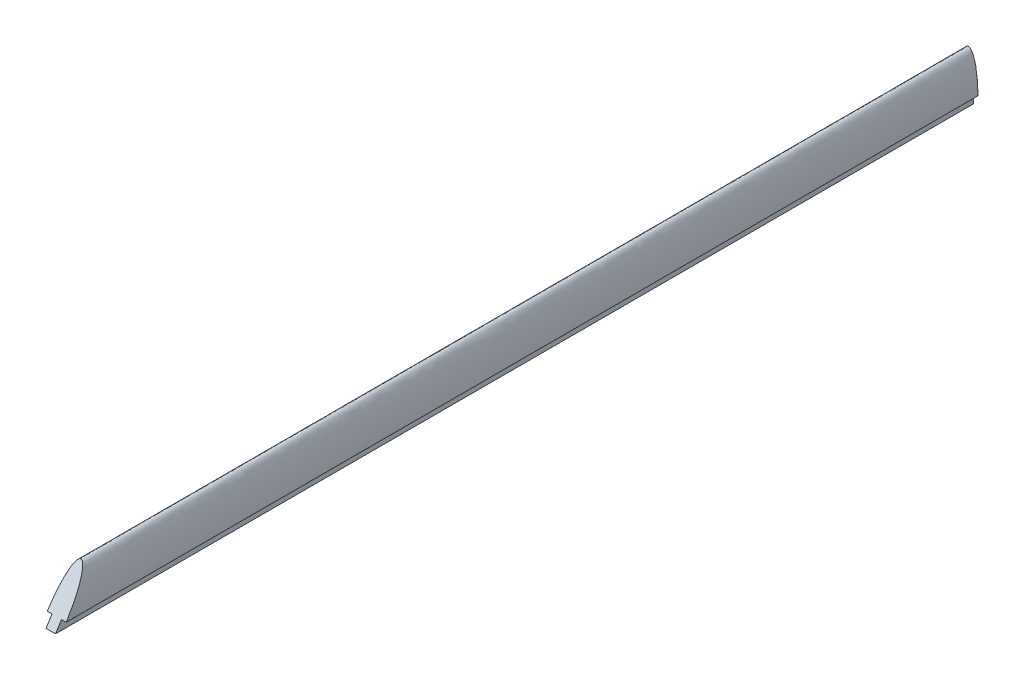
ISO-10303-21;
HEADER;
FILE_DESCRIPTION(('STEP AP214'),'2;1');
FILE_NAME('part.step','',(''),(''),'','','');
FILE_SCHEMA(('AUTOMOTIVE_DESIGN { 1 0 10303 214 1 1 1 1 }'));
ENDSEC;
DATA;
#1=APPLICATION_CONTEXT('core data for automotive mechanical design processes');
#2=APPLICATION_PROTOCOL_DEFINITION('international standard','automotive_design',2000,#1);
#3=PRODUCT_CONTEXT('',#1,'mechanical');
#4=PRODUCT('Part','Part','',(#3));
#5=PRODUCT_RELATED_PRODUCT_CATEGORY('part','',(#4));
#6=PRODUCT_DEFINITION_FORMATION('','',#4);
#7=PRODUCT_DEFINITION_CONTEXT('part definition',#1,'design');
#8=PRODUCT_DEFINITION('design','',#6,#7);
#9=PRODUCT_DEFINITION_SHAPE('','',#8);
#10=(LENGTH_UNIT() NAMED_UNIT(*) SI_UNIT(.MILLI.,.METRE.));
#11=(NAMED_UNIT(*) PLANE_ANGLE_UNIT() SI_UNIT($,.RADIAN.));
#12=(NAMED_UNIT(*) SI_UNIT($,.STERADIAN.) SOLID_ANGLE_UNIT());
#13=UNCERTAINTY_MEASURE_WITH_UNIT(LENGTH_MEASURE(1.E-05),#10,'distance_accuracy_value','');
#14=(GEOMETRIC_REPRESENTATION_CONTEXT(3) GLOBAL_UNCERTAINTY_ASSIGNED_CONTEXT((#13)) GLOBAL_UNIT_ASSIGNED_CONTEXT((#10,
#11,#12)) REPRESENTATION_CONTEXT('',''));
#15=CARTESIAN_POINT('',(0.,0.,0.));
#16=DIRECTION('',(0.,0.,1.));
#17=DIRECTION('',(1.,0.,0.));
#18=AXIS2_PLACEMENT_3D('',#15,#16,#17);
#19=CARTESIAN_POINT('',(10.,0.,2000.));
#20=DIRECTION('',(-1.,0.,0.));
#21=DIRECTION('',(0.,0.,1.));
#22=AXIS2_PLACEMENT_3D('',#19,#20,#21);
#23=PLANE('',#22);
#24=DIRECTION('',(0.,0.,-1.));
#25=VECTOR('',#24,1.);
#26=CARTESIAN_POINT('',(10.,0.,2000.));
#27=LINE('',#26,#25);
#28=CARTESIAN_POINT('',(10.,0.,1920.));
#29=VERTEX_POINT('',#28);
#30=CARTESIAN_POINT('',(10.,0.,0.));
#31=VERTEX_POINT('',#30);
#32=EDGE_CURVE('E39',#29,#31,#27,.T.);
#33=ORIENTED_EDGE('',*,*,#32,.F.);
#34=DIRECTION('',(0.,-0.844450969812463,0.535632858946117));
#35=VECTOR('',#34,1.);
#36=CARTESIAN_POINT('',(10.,-36.1852549760375,1942.95220476662));
#37=LINE('',#36,#35);
#38=CARTESIAN_POINT('',(10.,-20.,1932.68594336661));
#39=VERTEX_POINT('',#38);
#40=EDGE_CURVE('E100',#29,#39,#37,.T.);
#41=ORIENTED_EDGE('',*,*,#40,.T.);
#42=DIRECTION('',(0.,0.,-1.));
#43=VECTOR('',#42,1.);
#44=CARTESIAN_POINT('',(10.,-20.,2000.));
#45=LINE('',#44,#43);
#46=CARTESIAN_POINT('',(10.,-20.,0.));
#47=VERTEX_POINT('',#46);
#48=EDGE_CURVE('E53',#39,#47,#45,.T.);
#49=ORIENTED_EDGE('',*,*,#48,.T.);
#50=DIRECTION('',(0.,1.,0.));
#51=VECTOR('',#50,1.);
#52=CARTESIAN_POINT('',(10.,0.,0.));
#53=LINE('',#52,#51);
#54=EDGE_CURVE('E122',#47,#31,#53,.T.);
#55=ORIENTED_EDGE('',*,*,#54,.T.);
#56=EDGE_LOOP('',(#33,#41,#49,#55));
#57=FACE_BOUND('',#56,.T.);
#58=ADVANCED_FACE('F32',(#57),#23,.F.);
#59=CARTESIAN_POINT('',(10.,0.,2000.));
#60=DIRECTION('',(0.,1.,0.));
#61=DIRECTION('',(0.,0.,1.));
#62=AXIS2_PLACEMENT_3D('',#59,#60,#61);
#63=PLANE('',#62);
#64=DIRECTION('',(0.,0.,-1.));
#65=VECTOR('',#64,1.);
#66=CARTESIAN_POINT('',(20.,0.,2000.));
#67=LINE('',#66,#65);
#68=CARTESIAN_POINT('',(20.,0.,1920.));
#69=VERTEX_POINT('',#68);
#70=CARTESIAN_POINT('',(20.,0.,0.));
#71=VERTEX_POINT('',#70);
#72=EDGE_CURVE('E106',#69,#71,#67,.T.);
#73=ORIENTED_EDGE('',*,*,#72,.F.);
#74=DIRECTION('',(-1.,0.,0.));
#75=VECTOR('',#74,1.);
#76=CARTESIAN_POINT('',(10.,0.,1920.));
#77=LINE('',#76,#75);
#78=EDGE_CURVE('E88',#69,#29,#77,.T.);
#79=ORIENTED_EDGE('',*,*,#78,.T.);
#80=ORIENTED_EDGE('',*,*,#32,.T.);
#81=DIRECTION('',(1.,0.,0.));
#82=VECTOR('',#81,1.);
#83=CARTESIAN_POINT('',(10.,0.,0.));
#84=LINE('',#83,#82);
#85=EDGE_CURVE('E117',#31,#71,#84,.T.);
#86=ORIENTED_EDGE('',*,*,#85,.T.);
#87=EDGE_LOOP('',(#73,#79,#80,#86));
#88=FACE_BOUND('',#87,.T.);
#89=ADVANCED_FACE('F116',(#88),#63,.F.);
#90=CARTESIAN_POINT('',(0.,0.,2000.));
#91=DIRECTION('',(0.,0.,1.));
#92=DIRECTION('',(0.,-1.,0.));
#93=AXIS2_PLACEMENT_3D('',#90,#91,#92);
#94=ELLIPSE('',#93,80.,20.);
#95=DIRECTION('',(0.,0.,-1.));
#96=VECTOR('',#95,1.);
#97=SURFACE_OF_LINEAR_EXTRUSION('',#94,#96);
#98=DIRECTION('',(0.,0.,-1.));
#99=VECTOR('',#98,1.);
#100=CARTESIAN_POINT('',(-20.,0.,2000.));
#101=LINE('',#100,#99);
#102=CARTESIAN_POINT('',(-20.,0.,1920.));
#103=VERTEX_POINT('',#102);
#104=CARTESIAN_POINT('',(-20.,0.,0.));
#105=VERTEX_POINT('',#104);
#106=EDGE_CURVE('E97',#103,#105,#101,.T.);
#107=ORIENTED_EDGE('',*,*,#106,.F.);
#108=CARTESIAN_POINT('',(-4.42864563050915E-13,80.,1869.25622653355));
#109=CARTESIAN_POINT('',(-0.137687919968257,80.0000004665657,1869.25622623761));
#110=CARTESIAN_POINT('',(-0.275372692541939,79.9942950640277,1869.25984515828));
#111=CARTESIAN_POINT('',(-0.54943294657333,79.9716861023472,1869.27418595865));
#112=CARTESIAN_POINT('',(-0.685808457618269,79.9547827968666,1869.28490767746));
#113=CARTESIAN_POINT('',(-0.956303815824192,79.9103337153805,1869.31310160398));
#114=CARTESIAN_POINT('',(-1.0904198592393,79.8827715639573,1869.33058419858));
#115=CARTESIAN_POINT('',(-1.35528195641283,79.8178755296647,1869.37174756937));
#116=CARTESIAN_POINT('',(-1.48602750931655,79.7805402035923,1869.39542926097));
#117=CARTESIAN_POINT('',(-1.77750859224106,79.6860954021892,1869.45533533107));
#118=CARTESIAN_POINT('',(-1.93705408019342,79.6263676828639,1869.4932204543));
#119=CARTESIAN_POINT('',(-2.24918303058619,79.4949907281904,1869.57655248464));
#120=CARTESIAN_POINT('',(-2.40176055693495,79.4233315611128,1869.6220056914));
#121=CARTESIAN_POINT('',(-2.69991091822849,79.2699801174568,1869.71927607787));
#122=CARTESIAN_POINT('',(-2.84547381478771,79.1882741563678,1869.77110193762));
#123=CARTESIAN_POINT('',(-3.12951456027011,79.0166316549693,1869.87997429023));
#124=CARTESIAN_POINT('',(-3.26799401648468,78.926696994852,1869.93701959047));
#125=CARTESIAN_POINT('',(-3.64790534376513,78.6643078506271,1870.10345228166));
#126=CARTESIAN_POINT('',(-3.88179871374812,78.4840567438405,1870.21778504828));
#127=CARTESIAN_POINT('',(-4.33063745585276,78.1074317684746,1870.45667720368));
#128=CARTESIAN_POINT('',(-4.54556562697427,77.9110435693879,1870.58124568225));
#129=CARTESIAN_POINT('',(-4.95961530086016,77.5058942810028,1870.83823072863));
#130=CARTESIAN_POINT('',(-5.15869302698345,77.2971015289804,1870.97066738));
#131=CARTESIAN_POINT('',(-5.54268362371341,76.8706272755444,1871.24117879132));
#132=CARTESIAN_POINT('',(-5.72760215559895,76.6529493806187,1871.37925126368));
#133=CARTESIAN_POINT('',(-6.05194984856841,76.251904236322,1871.63363306308));
#134=CARTESIAN_POINT('',(-6.19343004975563,76.0697110650709,1871.7491976757));
#135=CARTESIAN_POINT('',(-6.46925847963252,75.7015019739393,1871.98275165955));
#136=CARTESIAN_POINT('',(-6.6036061258585,75.5154857435728,1872.10074122774));
#137=CARTESIAN_POINT('',(-6.86605375533977,75.1400558184138,1872.33887536617));
#138=CARTESIAN_POINT('',(-6.99414634898347,74.9506384502628,1872.45902226642));
#139=CARTESIAN_POINT('',(-7.2445540184623,74.5690946604549,1872.70103441189));
#140=CARTESIAN_POINT('',(-7.36686876737105,74.3769680863005,1872.82289975384));
#141=CARTESIAN_POINT('',(-7.72631052613271,73.7965971205659,1873.19102741399));
#142=CARTESIAN_POINT('',(-7.95558141520363,73.4048740915486,1873.43949622206));
#143=CARTESIAN_POINT('',(-8.39670471052417,72.6144527617927,1873.94085823332));
#144=CARTESIAN_POINT('',(-8.60855309423104,72.2157528758494,1874.19375244198));
#145=CARTESIAN_POINT('',(-9.01826028541719,71.4112891955769,1874.7040214764));
#146=CARTESIAN_POINT('',(-9.21605645976501,71.0055027329752,1874.96141068058));
#147=CARTESIAN_POINT('',(-9.5985042927989,70.1900951479531,1875.47862140279));
#148=CARTESIAN_POINT('',(-9.78317080365061,69.7804789711266,1875.73843978386));
#149=CARTESIAN_POINT('',(-10.1411311020845,68.9579623398582,1876.26015975398));
#150=CARTESIAN_POINT('',(-10.314430566066,68.5450636419175,1876.52206022889));
#151=CARTESIAN_POINT('',(-10.6510298646479,67.716418453853,1877.04766752523));
#152=CARTESIAN_POINT('',(-10.814330532936,67.3006722043773,1877.31137419401));
#153=CARTESIAN_POINT('',(-11.215922652633,66.2465085432686,1877.98002721921));
#154=CARTESIAN_POINT('',(-11.4482617117277,65.6064728100731,1878.38600007241));
#155=CARTESIAN_POINT('',(-11.8951556165903,64.3218069379439,1879.20085999735));
#156=CARTESIAN_POINT('',(-12.1097050506798,63.67717546526,1879.60974791509));
#157=CARTESIAN_POINT('',(-12.5232301601501,62.3843017843628,1880.42981402989));
#158=CARTESIAN_POINT('',(-12.7222042881245,61.7360592242238,1880.84099245018));
#159=CARTESIAN_POINT('',(-13.1057176089715,60.4387958843944,1881.66384291321));
#160=CARTESIAN_POINT('',(-13.2903018425835,59.7897845681328,1882.07550895333));
#161=CARTESIAN_POINT('',(-13.6471551056291,58.48943850442,1882.9003147794));
#162=CARTESIAN_POINT('',(-13.8194255886166,57.8381040407618,1883.31345438533));
#163=CARTESIAN_POINT('',(-14.1528288513974,56.5334295885214,1884.14100569598));
#164=CARTESIAN_POINT('',(-14.313961920446,55.8800896524849,1884.55541736737));
#165=CARTESIAN_POINT('',(-14.7039612909975,54.2451433029377,1885.59245920726));
#166=CARTESIAN_POINT('',(-14.9264917460114,53.2624574679788,1886.21577404973));
#167=CARTESIAN_POINT('',(-15.3513398447114,51.2939704863517,1887.46437976807));
#168=CARTESIAN_POINT('',(-15.5536570380459,50.3081692707773,1888.08967068765));
#169=CARTESIAN_POINT('',(-15.9402817964329,48.3331459475659,1889.34242238895));
#170=CARTESIAN_POINT('',(-16.1245729738767,47.3439215582756,1889.96988461792));
#171=CARTESIAN_POINT('',(-16.4765740668096,45.3633779715072,1891.22613780676));
#172=CARTESIAN_POINT('',(-16.6442839837465,44.372058774212,1891.85492876652));
#173=CARTESIAN_POINT('',(-16.9644690987423,42.3875370053154,1893.11370530502));
#174=CARTESIAN_POINT('',(-17.1169422595825,41.3943341999093,1893.74369103207));
#175=CARTESIAN_POINT('',(-17.4077177226433,39.4064433321372,1895.00460458044));
#176=CARTESIAN_POINT('',(-17.5460198721946,38.411755253887,1895.63553241185));
#177=CARTESIAN_POINT('',(-17.8093594081768,36.4210884383409,1896.89820673604));
#178=CARTESIAN_POINT('',(-17.934396252629,35.4251096499922,1897.52995326121));
#179=CARTESIAN_POINT('',(-18.1719455911696,33.4320850251356,1898.79412313717));
#180=CARTESIAN_POINT('',(-18.2844579876343,32.4350391803716,1899.4265464932));
#181=CARTESIAN_POINT('',(-18.6041331708076,29.4429873490489,1901.3243964973));
#182=CARTESIAN_POINT('',(-18.7934937828226,27.4466099489182,1902.59069302913));
#183=CARTESIAN_POINT('',(-19.128628971125,23.4513437775153,1905.12487904837));
#184=CARTESIAN_POINT('',(-19.2744048666718,21.4524550840966,1906.39276848642));
#185=CARTESIAN_POINT('',(-19.5249428793729,17.4547400851446,1908.92850779005));
#186=CARTESIAN_POINT('',(-19.6297435032825,15.4559154946867,1910.19635656776));
#187=CARTESIAN_POINT('',(-19.8003292160994,11.4570896424101,1912.73280048251));
#188=CARTESIAN_POINT('',(-19.8661143478724,9.45708838188642,1914.00139561872));
#189=CARTESIAN_POINT('',(-19.9597684913953,5.45548677946373,1916.53960018392));
#190=CARTESIAN_POINT('',(-19.9876191212315,3.45388613225588,1917.80920980657));
#191=CARTESIAN_POINT('',(-20.0057900092643,-0.549472605931801,1920.34852891802));
#192=CARTESIAN_POINT('',(-19.9961095784076,-2.55123069912754,1921.61823840822));
#193=CARTESIAN_POINT('',(-19.9390627895336,-6.55437895027086,1924.15742400832));
#194=CARTESIAN_POINT('',(-19.8916961898656,-8.55576910577685,1925.42690011669));
#195=CARTESIAN_POINT('',(-19.758513162832,-12.5576004165518,1927.96525038525));
#196=CARTESIAN_POINT('',(-19.6726975253128,-14.5580415904703,1929.23412455728));
#197=CARTESIAN_POINT('',(-19.4612274758521,-18.5565265670421,1931.77035225553));
#198=CARTESIAN_POINT('',(-19.3355910766956,-20.5545710444337,1933.03770620974));
#199=CARTESIAN_POINT('',(-19.0422366517212,-24.5483936203171,1935.57097656043));
#200=CARTESIAN_POINT('',(-18.8745201045304,-26.5441717959683,1936.83689300587));
#201=CARTESIAN_POINT('',(-18.4937576200597,-30.5328736698768,1939.3669153098));
#202=CARTESIAN_POINT('',(-18.2807074035776,-32.525797080772,1940.63102098603));
#203=CARTESIAN_POINT('',(-17.9236476900419,-35.5119723771667,1942.52514352067));
#204=CARTESIAN_POINT('',(-17.7983791070932,-36.5068380030012,1943.15618397001));
#205=CARTESIAN_POINT('',(-17.5345708893977,-38.495310717629,1944.4174665822));
#206=CARTESIAN_POINT('',(-17.3960313751879,-39.4889178177702,1945.04770875225));
#207=CARTESIAN_POINT('',(-17.1047593245081,-41.4748213346924,1946.30736172962));
#208=CARTESIAN_POINT('',(-16.9520243815787,-42.467117500216,1946.93677237755));
#209=CARTESIAN_POINT('',(-16.6312883283622,-44.4499563047756,1948.19448141654));
#210=CARTESIAN_POINT('',(-16.4632871787998,-45.4404989392937,1948.82277980473));
#211=CARTESIAN_POINT('',(-16.1106749426505,-47.4195671139868,1950.07809714387));
#212=CARTESIAN_POINT('',(-15.9260624277376,-48.4080924732187,1950.70511598005));
#213=CARTESIAN_POINT('',(-15.5386008186846,-50.382592657636,1951.9575358559));
#214=CARTESIAN_POINT('',(-15.3357518451584,-51.3685674996458,1952.58293690623));
#215=CARTESIAN_POINT('',(-14.9096174716281,-53.3380806177179,1953.83219350001));
#216=CARTESIAN_POINT('',(-14.6863180409859,-54.3216167382121,1954.45604767619));
#217=CARTESIAN_POINT('',(-14.2167702504179,-56.2848197631601,1955.70130179577));
#218=CARTESIAN_POINT('',(-13.9705211684928,-57.2644865448725,1956.32270166132));
#219=CARTESIAN_POINT('',(-13.4516660187623,-59.218895952328,1957.56237801423));
#220=CARTESIAN_POINT('',(-13.179059437021,-60.1936384816648,1958.18065444044));
#221=CARTESIAN_POINT('',(-12.7469237344694,-61.6507970002961,1959.10492596262));
#222=CARTESIAN_POINT('',(-12.599011550804,-62.1356784641265,1959.4124849021));
#223=CARTESIAN_POINT('',(-12.2946875130772,-63.1035324510184,1960.02639194534));
#224=CARTESIAN_POINT('',(-12.1382758110876,-63.5865050080681,1960.33274007066));
#225=CARTESIAN_POINT('',(-11.8160474697168,-64.5503216209514,1960.944086219));
#226=CARTESIAN_POINT('',(-11.6502288582739,-65.0311652075215,1961.24908394437));
#227=CARTESIAN_POINT('',(-11.3081570889527,-65.9902079923226,1961.85740206708));
#228=CARTESIAN_POINT('',(-11.1319038882779,-66.468407179699,1962.16072245753));
#229=CARTESIAN_POINT('',(-10.7678077406174,-67.421256683478,1962.76511219962));
#230=CARTESIAN_POINT('',(-10.5799736826793,-67.8959094158239,1963.06618308369));
#231=CARTESIAN_POINT('',(-10.1909980265481,-68.8413121005792,1963.66584932956));
#232=CARTESIAN_POINT('',(-9.98985688718007,-69.3120621869218,1963.96444477632));
#233=CARTESIAN_POINT('',(-9.62750756347625,-70.1246937489458,1964.47989467501));
#234=CARTESIAN_POINT('',(-9.46982603666983,-70.4676963688848,1964.69746026557));
#235=CARTESIAN_POINT('',(-9.14514694428069,-71.1505386669706,1965.13058520166));
#236=CARTESIAN_POINT('',(-8.97814973933862,-71.4903784669671,1965.34614462448));
#237=CARTESIAN_POINT('',(-8.63323035233078,-72.1669522311032,1965.77529344724));
#238=CARTESIAN_POINT('',(-8.45528560669708,-72.503678015238,1965.98887765862));
#239=CARTESIAN_POINT('',(-8.08725385170064,-73.172367415044,1966.41302545141));
#240=CARTESIAN_POINT('',(-7.89716757875363,-73.504331318043,1966.62358921507));
#241=CARTESIAN_POINT('',(-7.55897942344468,-74.0686332202913,1966.98152431375));
#242=CARTESIAN_POINT('',(-7.41432093138146,-74.3024424197636,1967.12982882691));
#243=CARTESIAN_POINT('',(-7.11686421965244,-74.7663823886353,1967.42410463544));
#244=CARTESIAN_POINT('',(-6.96406521273654,-74.9965127994597,1967.57007570337));
#245=CARTESIAN_POINT('',(-6.64919325950605,-75.4523725420466,1967.85922624725));
#246=CARTESIAN_POINT('',(-6.48711578088236,-75.6780996494658,1968.0024043123));
#247=CARTESIAN_POINT('',(-6.15303751457044,-76.1231664830499,1968.28470894456));
#248=CARTESIAN_POINT('',(-5.98107382345779,-76.3425259645469,1968.42384804252));
#249=CARTESIAN_POINT('',(-5.62519983618318,-76.7741308293338,1968.69761378609));
#250=CARTESIAN_POINT('',(-5.44129412776881,-76.9863788976535,1968.83224213481));
#251=CARTESIAN_POINT('',(-5.05969484133872,-77.401663677057,1969.09565609444));
#252=CARTESIAN_POINT('',(-4.86201295713581,-77.6047079647614,1969.22444651118));
#253=CARTESIAN_POINT('',(-4.53310385295094,-77.9196467221446,1969.42421127318));
#254=CARTESIAN_POINT('',(-4.40706161653164,-78.0354068294645,1969.49763758146));
#255=CARTESIAN_POINT('',(-4.14861195154692,-78.2617690782846,1969.6412185149));
#256=CARTESIAN_POINT('',(-4.01620461418791,-78.3723712936482,1969.71137318692));
#257=CARTESIAN_POINT('',(-3.7441568239699,-78.5875874440488,1969.8478841817));
#258=CARTESIAN_POINT('',(-3.60450124272322,-78.6921878092659,1969.91423189716));
#259=CARTESIAN_POINT('',(-3.3176537627111,-78.8937897435984,1970.04210743324));
#260=CARTESIAN_POINT('',(-3.17046183259065,-78.9907912810946,1970.1036352338));
#261=CARTESIAN_POINT('',(-2.86542218481074,-79.1771251196543,1970.22182625996));
#262=CARTESIAN_POINT('',(-2.70743327135739,-79.2662939098155,1970.27838577106));
#263=CARTESIAN_POINT('',(-2.38285671435307,-79.4328654001984,1970.38404159574));
#264=CARTESIAN_POINT('',(-2.2162672288695,-79.5102655658851,1970.43313630166));
#265=CARTESIAN_POINT('',(-1.87558125184638,-79.6503716232122,1970.52200517709));
#266=CARTESIAN_POINT('',(-1.70152653008391,-79.713149157442,1970.56182478928));
#267=CARTESIAN_POINT('',(-1.34624871204303,-79.8217280940964,1970.63069610134));
#268=CARTESIAN_POINT('',(-1.16503389049536,-79.867548492995,1970.65975985062));
#269=CARTESIAN_POINT('',(-0.820473715358701,-79.93524482619,1970.70269944307));
#270=CARTESIAN_POINT('',(-0.657762307030386,-79.9594141117615,1970.71802995247));
#271=CARTESIAN_POINT('',(-0.330025367398827,-79.9917922227357,1970.73856729658));
#272=CARTESIAN_POINT('',(-0.164999127999312,-79.999996052194,1970.74377096237));
#273=CARTESIAN_POINT('',(0.137648788622791,-80.0000032934157,1970.74377555546));
#274=CARTESIAN_POINT('',(0.275278708916851,-79.9942998338582,1970.74015786721));
#275=CARTESIAN_POINT('',(0.54928990946381,-79.9717008833517,1970.7258234169));
#276=CARTESIAN_POINT('',(0.685670738283606,-79.9548014962789,1970.71510418353));
#277=CARTESIAN_POINT('',(0.956163253763651,-79.910360747751,1970.68691554258));
#278=CARTESIAN_POINT('',(1.09027134205057,-79.8828039060204,1970.6694363159));
#279=CARTESIAN_POINT('',(1.35517925177963,-79.8179047417186,1970.62827095976));
#280=CARTESIAN_POINT('',(1.48597702955589,-79.7805565284716,1970.60458109385));
#281=CARTESIAN_POINT('',(1.77752138654214,-79.6860912963141,1970.54466206459));
#282=CARTESIAN_POINT('',(1.93707887671356,-79.6263583697968,1970.50677363844));
#283=CARTESIAN_POINT('',(2.24918635779785,-79.4949882017461,1970.42344591285));
#284=CARTESIAN_POINT('',(2.40173247104532,-79.4233444716634,1970.37800249773));
#285=CARTESIAN_POINT('',(2.69985030785062,-79.2700128293824,1970.28074467121));
#286=CARTESIAN_POINT('',(2.84541061406302,-79.188309203854,1970.2289202929));
#287=CARTESIAN_POINT('',(3.12947921157568,-79.0166561579684,1970.12004125196));
#288=CARTESIAN_POINT('',(3.26798807159774,-78.9267074042514,1970.06298701218));
#289=CARTESIAN_POINT('',(3.52557060638719,-78.748793719335,1969.95013686563));
#290=CARTESIAN_POINT('',(3.64524416647598,-78.6614441828441,1969.89473130198));
#291=CARTESIAN_POINT('',(3.87948061318513,-78.4819816159843,1969.780898704));
#292=CARTESIAN_POINT('',(3.99404272708684,-78.3898678699043,1969.72247121569));
#293=CARTESIAN_POINT('',(4.33073158450839,-78.1073604386157,1969.543277552));
#294=CARTESIAN_POINT('',(4.54573228149576,-77.9108914714757,1969.41865784247));
#295=CARTESIAN_POINT('',(4.9597994580377,-77.5057030799801,1969.16164799311));
#296=CARTESIAN_POINT('',(5.15882766907885,-77.2969561956904,1969.02924043551));
#297=CARTESIAN_POINT('',(5.54274050129532,-76.8705599008968,1968.75877847313));
#298=CARTESIAN_POINT('',(5.72763063640898,-76.652914012412,1968.62072630237));
#299=CARTESIAN_POINT('',(6.051848641815,-76.252029499203,1968.36644639081));
#300=CARTESIAN_POINT('',(6.19323188429445,-76.0699662765158,1968.2509642042));
#301=CARTESIAN_POINT('',(6.46887650405778,-75.7020211868958,1968.01757767576));
#302=CARTESIAN_POINT('',(6.60313730236449,-75.5161390112222,1967.89967313808));
#303=CARTESIAN_POINT('',(6.86541889753506,-75.1409813071571,1967.66171166872));
#304=CARTESIAN_POINT('',(6.9934323161464,-74.9517021110605,1967.54165241061));
#305=CARTESIAN_POINT('',(7.24368854911019,-74.5704374919157,1967.2998173423));
#306=CARTESIAN_POINT('',(7.36593103740604,-74.3784519167514,1967.17804143561));
#307=CARTESIAN_POINT('',(7.72516297712271,-73.7985104443857,1966.81018620189));
#308=CARTESIAN_POINT('',(7.95430532493436,-73.4070793742512,1966.56190258251));
#309=CARTESIAN_POINT('',(8.39518726016839,-72.6172524156742,1966.06091757921));
#310=CARTESIAN_POINT('',(8.60692303372412,-72.2188550239421,1965.80821524177));
#311=CARTESIAN_POINT('',(9.01673049382941,-71.4143911495419,1965.29794608421));
#312=CARTESIAN_POINT('',(9.21471691758361,-71.008293800501,1965.04035968565));
#313=CARTESIAN_POINT('',(9.59751934023448,-70.1922595753568,1964.52275148738));
#314=CARTESIAN_POINT('',(9.78235032759176,-69.7823276909658,1964.2627328539));
#315=CARTESIAN_POINT('',(10.1406046968005,-68.9592083028887,1963.74063055685));
#316=CARTESIAN_POINT('',(10.3140347200056,-68.5460228544318,1963.47854819689));
#317=CARTESIAN_POINT('',(10.6508539225391,-67.7168668387578,1962.95261688405));
#318=CARTESIAN_POINT('',(10.8142455529563,-67.300896979144,1962.68876837998));
#319=CARTESIAN_POINT('',(11.2041777167179,-66.2773360631083,1962.03952658933));
#320=CARTESIAN_POINT('',(11.4257522040163,-65.6683953643159,1961.6532772284));
#321=CARTESIAN_POINT('',(11.8526294624833,-64.4464429582104,1960.87819627738));
#322=CARTESIAN_POINT('',(12.057931229208,-63.8334310021237,1960.48936452948));
#323=CARTESIAN_POINT('',(12.4543822453035,-62.6036830519449,1959.70933888692));
#324=CARTESIAN_POINT('',(12.6455211095502,-61.9869446768763,1959.31814348201));
#325=CARTESIAN_POINT('',(13.0150665815765,-60.7507749921288,1958.5340445514));
#326=CARTESIAN_POINT('',(13.1934734419396,-60.1313437361312,1958.14114105975));
#327=CARTESIAN_POINT('',(13.5390680450584,-58.889409124136,1957.3533854521));
#328=CARTESIAN_POINT('',(13.7062409034105,-58.2669028214919,1956.95853146707));
#329=CARTESIAN_POINT('',(14.0301731816551,-57.0199626022288,1956.16760081691));
#330=CARTESIAN_POINT('',(14.1869325556994,-56.3955286771355,1955.77152414642));
#331=CARTESIAN_POINT('',(14.4910857792819,-55.1443307052812,1954.97789281585));
#332=CARTESIAN_POINT('',(14.6384692504018,-54.517564862201,1954.58033701638));
#333=CARTESIAN_POINT('',(14.9244258106142,-53.2625992208499,1953.78431586372));
#334=CARTESIAN_POINT('',(15.0629988050078,-52.6343994072411,1953.3858505008));
#335=CARTESIAN_POINT('',(15.4666183287416,-50.7472707311289,1952.18885012526));
#336=CARTESIAN_POINT('',(15.7194086542993,-49.4864635745361,1951.38912371603));
#337=CARTESIAN_POINT('',(16.1963296671993,-46.9612961686707,1949.78741718093));
#338=CARTESIAN_POINT('',(16.420466374256,-45.6969367229137,1948.98543756473));
#339=CARTESIAN_POINT('',(16.8432377857342,-43.1648422876352,1947.37933723449));
#340=CARTESIAN_POINT('',(17.041865589424,-41.8971064790094,1946.57521600088));
#341=CARTESIAN_POINT('',(17.4157216917153,-39.3604769428187,1944.96623906897));
#342=CARTESIAN_POINT('',(17.5909732314227,-38.091585647372,1944.16138491335));
#343=CARTESIAN_POINT('',(17.9200465507725,-35.5526916983943,1942.55097167082));
#344=CARTESIAN_POINT('',(18.0738826404617,-34.2826903631642,1941.74541342011));
#345=CARTESIAN_POINT('',(18.3616719168417,-31.7415917315547,1940.13360175363));
#346=CARTESIAN_POINT('',(18.4956329048252,-30.4704950632122,1939.32734873623));
#347=CARTESIAN_POINT('',(18.744894257215,-27.9271948498532,1937.71414061268));
#348=CARTESIAN_POINT('',(18.8601974417544,-26.6549915013925,1936.90718563121));
#349=CARTESIAN_POINT('',(19.0731089380085,-24.1094475634578,1935.29255431952));
#350=CARTESIAN_POINT('',(19.1707160708715,-22.8361069038941,1934.48487794484));
#351=CARTESIAN_POINT('',(19.3569398687832,-20.1747016260848,1932.79675611334));
#352=CARTESIAN_POINT('',(19.4439726014108,-18.786557995797,1931.91626053941));
#353=CARTESIAN_POINT('',(19.5986771094564,-16.0091896883527,1930.15458368659));
#354=CARTESIAN_POINT('',(19.6663444989606,-14.6199648376429,1929.27340229761));
#355=CARTESIAN_POINT('',(19.7828549193075,-11.8407729476889,1927.51056875157));
#356=CARTESIAN_POINT('',(19.8316955029727,-10.450805835461,1926.62891654821));
#357=CARTESIAN_POINT('',(19.910929242392,-7.67046491426482,1924.8653541749));
#358=CARTESIAN_POINT('',(19.9413219624892,-6.28009109646764,1923.98344399935));
#359=CARTESIAN_POINT('',(19.9838618991586,-3.50127396388006,1922.22084816084));
#360=CARTESIAN_POINT('',(19.9960369778088,-2.11283095240124,1921.34016269027));
#361=CARTESIAN_POINT('',(20.0023230234541,0.663984735655706,1919.57883636236));
#362=CARTESIAN_POINT('',(19.9964352845353,2.05235741014648,1918.69819550634));
#363=CARTESIAN_POINT('',(19.9665540703563,4.82890040634167,1916.93704214611));
#364=CARTESIAN_POINT('',(19.9425614243007,6.21707073440132,1916.05652963786));
#365=CARTESIAN_POINT('',(19.8762872881419,8.99307704420982,1914.29571669628));
#366=CARTESIAN_POINT('',(19.8340061201397,10.3809130314164,1913.41541625949));
#367=CARTESIAN_POINT('',(19.7353986908928,13.0329880013415,1911.73321261586));
#368=CARTESIAN_POINT('',(19.6806512427727,14.2972689362262,1910.93128279889));
#369=CARTESIAN_POINT('',(19.5553230178987,16.825282068736,1909.32777122744));
#370=CARTESIAN_POINT('',(19.4847421257408,18.0890142622944,1908.52618947553));
#371=CARTESIAN_POINT('',(19.3272565364233,20.6157678398201,1906.92347683624));
#372=CARTESIAN_POINT('',(19.2403516705548,21.8787892163059,1906.12234595359));
#373=CARTESIAN_POINT('',(19.0495587184083,24.404298393518,1904.5204226339));
#374=CARTESIAN_POINT('',(18.9456655624219,25.6667859218284,1903.71963036964));
#375=CARTESIAN_POINT('',(18.7201176644368,28.1906219485332,1902.11876832457));
#376=CARTESIAN_POINT('',(18.5984630656057,29.4519704560265,1901.31869853798));
#377=CARTESIAN_POINT('',(18.3363962055641,31.9732583176399,1899.71945278682));
#378=CARTESIAN_POINT('',(18.1959842784862,33.2331976964585,1898.92027680656));
#379=CARTESIAN_POINT('',(17.891213115525,35.7843964819549,1897.30205864107));
#380=CARTESIAN_POINT('',(17.7263224543416,37.0756107835898,1896.48304506584));
#381=CARTESIAN_POINT('',(17.3737906990033,39.6558228401361,1894.84642386468));
#382=CARTESIAN_POINT('',(17.1861497543373,40.9448206095556,1894.02881622955));
#383=CARTESIAN_POINT('',(16.7860096108217,43.5198359578833,1892.3954912857));
#384=CARTESIAN_POINT('',(16.5735148750302,44.8058540296943,1891.57977366433));
#385=CARTESIAN_POINT('',(16.1209013978032,47.3744167074674,1889.95054163114));
#386=CARTESIAN_POINT('',(15.8807832379729,48.6569613859793,1889.1370271733));
#387=CARTESIAN_POINT('',(15.4494880328604,50.8161071479349,1887.76748713048));
#388=CARTESIAN_POINT('',(15.2665757014706,51.6938872494062,1887.2107136977));
#389=CARTESIAN_POINT('',(14.8845130819719,53.4469208259631,1886.0987694641));
#390=CARTESIAN_POINT('',(14.685363038771,54.3221743389502,1885.54359863924));
#391=CARTESIAN_POINT('',(14.2689341213774,56.0697584073383,1884.43511101324));
#392=CARTESIAN_POINT('',(14.0516522754448,56.9420884591283,1883.88179453154));
#393=CARTESIAN_POINT('',(13.5966449746298,58.6829371480727,1882.77757913765));
#394=CARTESIAN_POINT('',(13.3589200762182,59.5514558882972,1882.22668016009));
#395=CARTESIAN_POINT('',(12.937247264004,61.0153473491773,1881.29813795171));
#396=CARTESIAN_POINT('',(12.7594545762614,61.6119852997926,1880.91969218911));
#397=CARTESIAN_POINT('',(12.3913833516213,62.8025059155849,1880.16454833368));
#398=CARTESIAN_POINT('',(12.2011050671663,63.3963886362093,1879.78785020566));
#399=CARTESIAN_POINT('',(11.8065999990272,64.58049036736,1879.03677783058));
#400=CARTESIAN_POINT('',(11.6023810972216,65.1707112456612,1878.66240239878));
#401=CARTESIAN_POINT('',(11.1779323611355,66.34703318355,1877.91626472453));
#402=CARTESIAN_POINT('',(10.9577031271232,66.9331343966918,1877.54450238468));
#403=CARTESIAN_POINT('',(10.5685598509831,67.9224570405174,1876.91697783314));
#404=CARTESIAN_POINT('',(10.4044393171626,68.327023438739,1876.66036251235));
#405=CARTESIAN_POINT('',(10.0661253361554,69.1331370600754,1876.14904692498));
#406=CARTESIAN_POINT('',(9.89193223250875,69.5346843856329,1875.89434659343));
#407=CARTESIAN_POINT('',(9.53186671976118,70.334742402312,1875.38687205895));
#408=CARTESIAN_POINT('',(9.3459767975707,70.733247487675,1875.13410141174));
#409=CARTESIAN_POINT('',(8.96109903210719,71.5257261941026,1874.63143441229));
#410=CARTESIAN_POINT('',(8.7621118177884,71.9197000316995,1874.3815379227));
#411=CARTESIAN_POINT('',(8.4150717593928,72.5766535526218,1873.96483416466));
#412=CARTESIAN_POINT('',(8.27111596440925,72.8411771174405,1873.79704761654));
#413=CARTESIAN_POINT('',(7.97531210925868,73.3670893984823,1873.46346294588));
#414=CARTESIAN_POINT('',(7.82346356387066,73.6284779207544,1873.29766494637));
#415=CARTESIAN_POINT('',(7.51083275880046,74.1475340051249,1872.96842914185));
#416=CARTESIAN_POINT('',(7.3500476588762,74.4052003510687,1872.80499210824));
#417=CARTESIAN_POINT('',(7.01881467740148,74.9151690738883,1872.48152039142));
#418=CARTESIAN_POINT('',(6.84839443580548,75.1674841973948,1872.32147762305));
#419=CARTESIAN_POINT('',(6.49604073365049,75.6662547342059,1872.00510888391));
#420=CARTESIAN_POINT('',(6.31411009299319,75.9127115625202,1871.84878201559));
#421=CARTESIAN_POINT('',(5.93693291163764,76.3981256230047,1871.54088525156));
#422=CARTESIAN_POINT('',(5.74169368896028,76.6370868728986,1871.38931280741));
#423=CARTESIAN_POINT('',(5.411579601736,77.0176331926971,1871.14793335434));
#424=CARTESIAN_POINT('',(5.28147857744331,77.1621732221905,1871.05625202293));
#425=CARTESIAN_POINT('',(5.01444417748567,77.4466997249595,1870.8757776679));
#426=CARTESIAN_POINT('',(4.87751086786915,77.5866862422326,1870.78698461639));
#427=CARTESIAN_POINT('',(4.5957058355793,77.8614743992055,1870.61268726653));
#428=CARTESIAN_POINT('',(4.45081525321801,77.9962623075956,1870.52719167792));
#429=CARTESIAN_POINT('',(4.1525578009012,78.2590145743909,1870.36052865912));
#430=CARTESIAN_POINT('',(3.99919095003742,78.386978948164,1870.27936121919));
#431=CARTESIAN_POINT('',(3.68077977364704,78.6362323472216,1870.12126049397));
#432=CARTESIAN_POINT('',(3.51559784340265,78.7573969169144,1870.04440615051));
#433=CARTESIAN_POINT('',(3.17463682423758,78.9887667810717,1869.89764890084));
#434=CARTESIAN_POINT('',(2.99885513579692,79.0989693694818,1869.82774771107));
#435=CARTESIAN_POINT('',(2.63675444190839,79.3050661925384,1869.6970210798));
#436=CARTESIAN_POINT('',(2.45047751068006,79.4010126331028,1869.63616252424));
#437=CARTESIAN_POINT('',(2.06678698696929,79.5754294772233,1869.5255304139));
#438=CARTESIAN_POINT('',(1.8693836861346,79.6539157090881,1869.47574681928));
#439=CARTESIAN_POINT('',(1.53438126329044,79.765996737839,1869.40465414012));
#440=CARTESIAN_POINT('',(1.3996515267497,79.8057365404269,1869.37944729587));
#441=CARTESIAN_POINT('',(1.12650236598456,79.874872001358,1869.33559486877));
#442=CARTESIAN_POINT('',(0.988083604117496,79.9042695033595,1869.31694811649));
#443=CARTESIAN_POINT('',(0.70877033306565,79.9517000086184,1869.28686308131));
#444=CARTESIAN_POINT('',(0.567880512515109,79.9697525513751,1869.27541240456));
#445=CARTESIAN_POINT('',(0.284659309192468,79.9939021131976,1869.26009440588));
#446=CARTESIAN_POINT('',(0.142327973045237,79.9999995177111,1869.25622683946));
#447=CARTESIAN_POINT('',(-4.42864563050915E-13,80.,1869.25622653355));
#448=B_SPLINE_CURVE_WITH_KNOTS('',3,(#108,#109,#110,#111,#112,#113,#114,#115,#116,#117,#118,
#119,#120,#121,#122,#123,#124,#125,#126,#127,#128,#129,#130,#131,#132,#133,#134,#135,#136,#137,
#138,#139,#140,#141,#142,#143,#144,#145,#146,#147,#148,#149,#150,#151,#152,#153,#154,#155,#156,
#157,#158,#159,#160,#161,#162,#163,#164,#165,#166,#167,#168,#169,#170,#171,#172,#173,#174,#175,
#176,#177,#178,#179,#180,#181,#182,#183,#184,#185,#186,#187,#188,#189,#190,#191,#192,#193,#194,
#195,#196,#197,#198,#199,#200,#201,#202,#203,#204,#205,#206,#207,#208,#209,#210,#211,#212,#213,
#214,#215,#216,#217,#218,#219,#220,#221,#222,#223,#224,#225,#226,#227,#228,#229,#230,#231,#232,
#233,#234,#235,#236,#237,#238,#239,#240,#241,#242,#243,#244,#245,#246,#247,#248,#249,#250,#251,
#252,#253,#254,#255,#256,#257,#258,#259,#260,#261,#262,#263,#264,#265,#266,#267,#268,#269,#270,
#271,#272,#273,#274,#275,#276,#277,#278,#279,#280,#281,#282,#283,#284,#285,#286,#287,#288,#289,
#290,#291,#292,#293,#294,#295,#296,#297,#298,#299,#300,#301,#302,#303,#304,#305,#306,#307,#308,
#309,#310,#311,#312,#313,#314,#315,#316,#317,#318,#319,#320,#321,#322,#323,#324,#325,#326,#327,
#328,#329,#330,#331,#332,#333,#334,#335,#336,#337,#338,#339,#340,#341,#342,#343,#344,#345,#346,
#347,#348,#349,#350,#351,#352,#353,#354,#355,#356,#357,#358,#359,#360,#361,#362,#363,#364,#365,
#366,#367,#368,#369,#370,#371,#372,#373,#374,#375,#376,#377,#378,#379,#380,#381,#382,#383,#384,
#385,#386,#387,#388,#389,#390,#391,#392,#393,#394,#395,#396,#397,#398,#399,#400,#401,#402,#403,
#404,#405,#406,#407,#408,#409,#410,#411,#412,#413,#414,#415,#416,#417,#418,#419,#420,#421,#422,
#423,#424,#425,#426,#427,#428,#429,#430,#431,#432,#433,#434,#435,#436,#437,#438,#439,#440,#441,
#442,#443,#444,#445,#446,#447),.UNSPECIFIED.,.T.,.F.,(4,2,2,2,2,2,2,2,2,2,2,2,2,2,2,2,2,2,2,2,2,
2,2,2,2,2,2,2,2,2,2,2,2,2,2,2,2,2,2,2,2,2,2,2,2,2,2,2,2,2,2,2,2,2,2,2,2,2,2,2,2,2,2,2,2,2,2,2,2,
2,2,2,2,2,2,2,2,2,2,2,2,2,2,2,2,2,2,2,2,2,2,2,2,2,2,2,2,2,2,2,2,2,2,2,2,2,2,2,2,2,2,2,2,2,2,2,2,
2,2,2,2,2,2,2,2,2,2,2,2,2,2,2,2,2,2,2,2,2,2,2,2,2,2,2,2,2,2,2,2,2,2,2,2,2,2,2,2,2,2,2,2,2,2,2,2,
2,2,2,2,4),(0.,0.412895985831385,0.825782618801391,1.23930611478249,1.65289071019014,
2.17560816371215,2.69876292231478,3.22263831999832,3.74639431384015,4.69470995604642,
5.64387704299784,6.5955806809018,7.54690178975449,8.32076729512888,9.09469589954577,
9.86951772326928,10.644383336161,12.1962199694817,13.7484138939066,15.3071408024675,
16.8640754750369,18.4202266417865,19.9762478813215,22.3541980685959,24.7328690044317,
27.1117759620338,29.4829100317705,31.8537637415488,34.2245558535466,37.7786898684226,
41.3329030517911,44.890317941438,48.4477325204924,52.005622106299,55.5635500184861,
59.1216232405257,62.6797241945861,69.7942925689129,76.9086455716387,84.016296656103,
91.1239399314759,98.235026132246,105.346242889977,112.457505246516,119.56862152533,
126.676525694836,133.784180139261,140.892505797703,144.446731823583,148.000925570249,
151.555722939218,155.110529453851,158.665641920663,162.220730876075,165.778277442825,
169.335935968311,172.893663877362,174.672438135487,176.451180578554,178.230297304609,
180.009421328054,181.787196362707,183.56491013202,184.871963246079,186.178965794865,
187.488758788028,188.798472414081,189.735526621723,190.672671614761,191.610278352659,
192.544571301154,193.478507423167,194.411660215586,194.970154520636,195.528640825328,
196.088343744823,196.648048993154,197.217528464833,197.787130408556,198.353879995833,
198.919992737912,199.414601862067,199.909365735485,200.322117297608,200.735012570597,
201.148509852729,201.562256475873,202.085014870266,202.6080589822,203.131930695819,
203.655760090343,204.130101525125,204.604514426784,205.553841473273,206.505379026287,
207.456543560623,208.229866617494,209.003252441086,209.777530574046,210.551852401363,
212.102589068434,213.653664609009,215.213629323654,216.771787279935,218.329029375494,
219.885889713351,222.148796889882,224.4118436372,226.676533698943,228.941178820199,
231.208767600775,233.476366364347,235.746433014659,238.016524060493,242.559065469437,
247.100650981753,251.643462518574,256.181723298848,260.716936854126,265.250365529562,
269.783108334383,274.316152984482,279.254464384065,284.193893341833,289.133964128433,
294.074151573153,299.006775740203,303.939046524296,308.871091424095,313.803049463286,
318.297460825757,322.791904947323,327.2863955217,331.782229814692,336.278027870638,
340.77374585161,345.387357399255,350.000938633195,354.613692662988,359.226349590007,
362.392557319025,365.558717302017,368.725397230739,371.891990988001,374.077592909816,
376.263150655225,378.447482783315,380.631733057384,382.150898258322,383.67001167637,
385.191456360175,386.712828034852,387.746967705476,388.781171027061,389.815704942926,
390.847408472563,391.878860219373,392.909749304656,393.554595128653,394.199434720064,
394.845874812251,395.492313448471,396.148172612947,396.804193281877,397.457749040369,
398.110709890555,398.538348841338,398.965911520887,399.39273577354,399.819546264655),.UNSPECIFIED.);
#449=EDGE_CURVE('E83',#69,#103,#448,.T.);
#450=ORIENTED_EDGE('',*,*,#449,.F.);
#451=ORIENTED_EDGE('',*,*,#72,.T.);
#452=CARTESIAN_POINT('',(0.,0.,0.));
#453=DIRECTION('',(0.,0.,1.));
#454=DIRECTION('',(0.,-1.,0.));
#455=AXIS2_PLACEMENT_3D('',#452,#453,#454);
#456=ELLIPSE('',#455,80.,20.);
#457=EDGE_CURVE('E104',#71,#105,#456,.T.);
#458=ORIENTED_EDGE('',*,*,#457,.T.);
#459=EDGE_LOOP('',(#107,#450,#451,#458));
#460=FACE_BOUND('',#459,.T.);
#461=ADVANCED_FACE('F102',(#460),#97,.F.);
#462=CARTESIAN_POINT('',(-20.,0.,2000.));
#463=DIRECTION('',(0.,1.,0.));
#464=DIRECTION('',(-1.,0.,0.));
#465=AXIS2_PLACEMENT_3D('',#462,#463,#464);
#466=PLANE('',#465);
#467=DIRECTION('',(0.,0.,-1.));
#468=VECTOR('',#467,1.);
#469=CARTESIAN_POINT('',(-10.,0.,2000.));
#470=LINE('',#469,#468);
#471=CARTESIAN_POINT('',(-10.,0.,1920.));
#472=VERTEX_POINT('',#471);
#473=CARTESIAN_POINT('',(-10.,0.,0.));
#474=VERTEX_POINT('',#473);
#475=EDGE_CURVE('E99',#472,#474,#470,.T.);
#476=ORIENTED_EDGE('',*,*,#475,.F.);
#477=DIRECTION('',(-1.,0.,0.));
#478=VECTOR('',#477,1.);
#479=CARTESIAN_POINT('',(-20.,0.,1920.));
#480=LINE('',#479,#478);
#481=EDGE_CURVE('E86',#472,#103,#480,.T.);
#482=ORIENTED_EDGE('',*,*,#481,.T.);
#483=ORIENTED_EDGE('',*,*,#106,.T.);
#484=DIRECTION('',(1.,0.,0.));
#485=VECTOR('',#484,1.);
#486=CARTESIAN_POINT('',(-20.,0.,0.));
#487=LINE('',#486,#485);
#488=EDGE_CURVE('E130',#105,#474,#487,.T.);
#489=ORIENTED_EDGE('',*,*,#488,.T.);
#490=EDGE_LOOP('',(#476,#482,#483,#489));
#491=FACE_BOUND('',#490,.T.);
#492=ADVANCED_FACE('F95',(#491),#466,.F.);
#493=CARTESIAN_POINT('',(-10.,0.,2000.));
#494=DIRECTION('',(1.,0.,0.));
#495=DIRECTION('',(0.,0.,-1.));
#496=AXIS2_PLACEMENT_3D('',#493,#494,#495);
#497=PLANE('',#496);
#498=DIRECTION('',(0.,0.,-1.));
#499=VECTOR('',#498,1.);
#500=CARTESIAN_POINT('',(-10.,-20.,2000.));
#501=LINE('',#500,#499);
#502=CARTESIAN_POINT('',(-10.,-20.,1932.68594336661));
#503=VERTEX_POINT('',#502);
#504=CARTESIAN_POINT('',(-10.,-20.,0.));
#505=VERTEX_POINT('',#504);
#506=EDGE_CURVE('E109',#503,#505,#501,.T.);
#507=ORIENTED_EDGE('',*,*,#506,.F.);
#508=DIRECTION('',(0.,0.844450969812463,-0.535632858946117));
#509=VECTOR('',#508,1.);
#510=CARTESIAN_POINT('',(-10.,-36.1852549760375,1942.95220476662));
#511=LINE('',#510,#509);
#512=EDGE_CURVE('E46',#503,#472,#511,.T.);
#513=ORIENTED_EDGE('',*,*,#512,.T.);
#514=ORIENTED_EDGE('',*,*,#475,.T.);
#515=DIRECTION('',(0.,-1.,0.));
#516=VECTOR('',#515,1.);
#517=CARTESIAN_POINT('',(-10.,0.,0.));
#518=LINE('',#517,#516);
#519=EDGE_CURVE('E132',#474,#505,#518,.T.);
#520=ORIENTED_EDGE('',*,*,#519,.T.);
#521=EDGE_LOOP('',(#507,#513,#514,#520));
#522=FACE_BOUND('',#521,.T.);
#523=ADVANCED_FACE('F142',(#522),#497,.F.);
#524=CARTESIAN_POINT('',(-10.,-20.,2000.));
#525=DIRECTION('',(0.,1.,0.));
#526=DIRECTION('',(0.,0.,1.));
#527=AXIS2_PLACEMENT_3D('',#524,#525,#526);
#528=PLANE('',#527);
#529=ORIENTED_EDGE('',*,*,#48,.F.);
#530=DIRECTION('',(-1.,0.,0.));
#531=VECTOR('',#530,1.);
#532=CARTESIAN_POINT('',(-10.,-20.,1932.68594336661));
#533=LINE('',#532,#531);
#534=EDGE_CURVE('E11',#39,#503,#533,.T.);
#535=ORIENTED_EDGE('',*,*,#534,.T.);
#536=ORIENTED_EDGE('',*,*,#506,.T.);
#537=DIRECTION('',(1.,0.,0.));
#538=VECTOR('',#537,1.);
#539=CARTESIAN_POINT('',(-10.,-20.,0.));
#540=LINE('',#539,#538);
#541=EDGE_CURVE('E135',#505,#47,#540,.T.);
#542=ORIENTED_EDGE('',*,*,#541,.T.);
#543=EDGE_LOOP('',(#529,#535,#536,#542));
#544=FACE_BOUND('',#543,.T.);
#545=ADVANCED_FACE('F139',(#544),#528,.F.);
#546=CARTESIAN_POINT('',(0.,0.,0.));
#547=DIRECTION('',(0.,0.,1.));
#548=DIRECTION('',(1.,0.,0.));
#549=AXIS2_PLACEMENT_3D('',#546,#547,#548);
#550=PLANE('',#549);
#551=ORIENTED_EDGE('',*,*,#54,.F.);
#552=ORIENTED_EDGE('',*,*,#541,.F.);
#553=ORIENTED_EDGE('',*,*,#519,.F.);
#554=ORIENTED_EDGE('',*,*,#488,.F.);
#555=ORIENTED_EDGE('',*,*,#457,.F.);
#556=ORIENTED_EDGE('',*,*,#85,.F.);
#557=EDGE_LOOP('',(#551,#552,#553,#554,#555,#556));
#558=FACE_BOUND('',#557,.T.);
#559=ADVANCED_FACE('F120',(#558),#550,.F.);
#560=CARTESIAN_POINT('',(-1873.50635590323,-126.123848559098,2000.));
#561=DIRECTION('',(0.,-0.535632858946117,-0.844450969812462));
#562=DIRECTION('',(0.,0.844450969812463,-0.535632858946117));
#563=AXIS2_PLACEMENT_3D('',#560,#561,#562);
#564=PLANE('',#563);
#565=ORIENTED_EDGE('',*,*,#449,.T.);
#566=ORIENTED_EDGE('',*,*,#481,.F.);
#567=ORIENTED_EDGE('',*,*,#512,.F.);
#568=ORIENTED_EDGE('',*,*,#534,.F.);
#569=ORIENTED_EDGE('',*,*,#40,.F.);
#570=ORIENTED_EDGE('',*,*,#78,.F.);
#571=EDGE_LOOP('',(#565,#566,#567,#568,#569,#570));
#572=FACE_BOUND('',#571,.T.);
#573=ADVANCED_FACE('F85',(#572),#564,.F.);
#574=CLOSED_SHELL('',(#58,#89,#461,#492,#523,#545,#559,#573));
#575=MANIFOLD_SOLID_BREP('B2',#574);
#576=ADVANCED_BREP_SHAPE_REPRESENTATION('',(#18,#575),#14);
#577=SHAPE_DEFINITION_REPRESENTATION(#9,#576);
ENDSEC;
END-ISO-10303-21;
